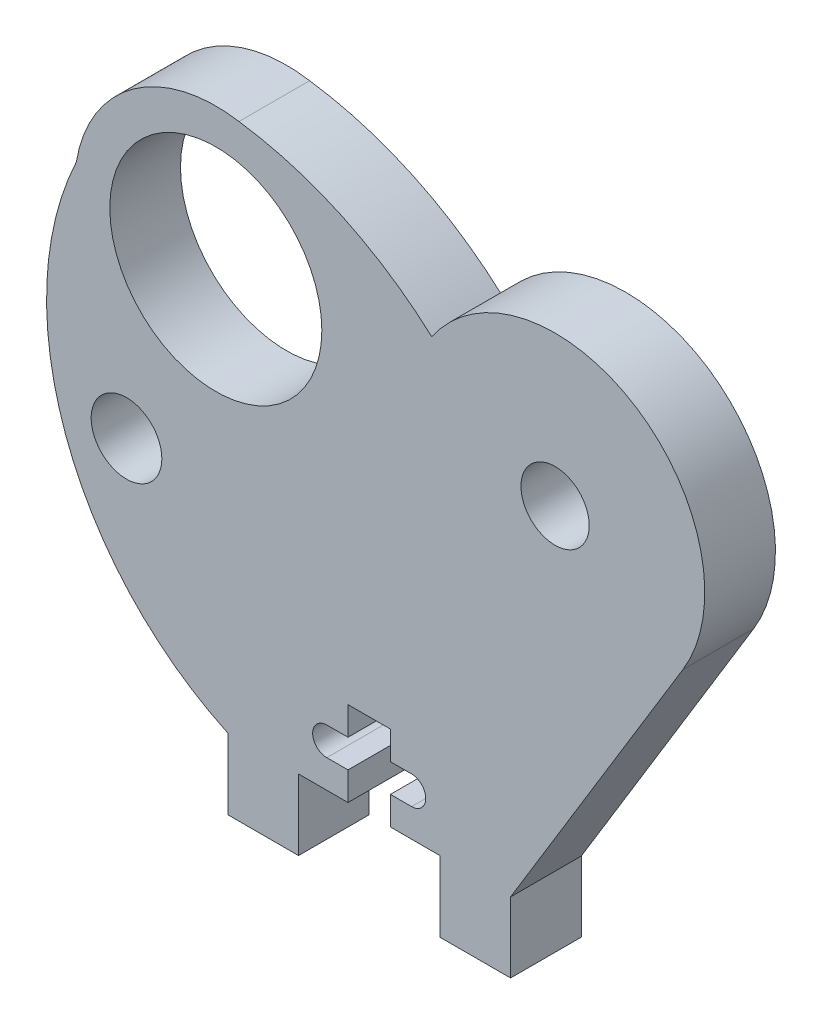
ISO-10303-21;
HEADER;
FILE_DESCRIPTION(('STEP AP214'),'2;1');
FILE_NAME('part.step','',(''),(''),'','','');
FILE_SCHEMA(('AUTOMOTIVE_DESIGN { 1 0 10303 214 1 1 1 1 }'));
ENDSEC;
DATA;
#1=APPLICATION_CONTEXT('core data for automotive mechanical design processes');
#2=APPLICATION_PROTOCOL_DEFINITION('international standard','automotive_design',2000,#1);
#3=PRODUCT_CONTEXT('',#1,'mechanical');
#4=PRODUCT('Part','Part','',(#3));
#5=PRODUCT_RELATED_PRODUCT_CATEGORY('part','',(#4));
#6=PRODUCT_DEFINITION_FORMATION('','',#4);
#7=PRODUCT_DEFINITION_CONTEXT('part definition',#1,'design');
#8=PRODUCT_DEFINITION('design','',#6,#7);
#9=PRODUCT_DEFINITION_SHAPE('','',#8);
#10=(LENGTH_UNIT() NAMED_UNIT(*) SI_UNIT(.MILLI.,.METRE.));
#11=(NAMED_UNIT(*) PLANE_ANGLE_UNIT() SI_UNIT($,.RADIAN.));
#12=(NAMED_UNIT(*) SI_UNIT($,.STERADIAN.) SOLID_ANGLE_UNIT());
#13=UNCERTAINTY_MEASURE_WITH_UNIT(LENGTH_MEASURE(1.E-05),#10,'distance_accuracy_value','');
#14=(GEOMETRIC_REPRESENTATION_CONTEXT(3) GLOBAL_UNCERTAINTY_ASSIGNED_CONTEXT((#13)) GLOBAL_UNIT_ASSIGNED_CONTEXT((#10,
#11,#12)) REPRESENTATION_CONTEXT('',''));
#15=CARTESIAN_POINT('',(0.,0.,0.));
#16=DIRECTION('',(0.,0.,1.));
#17=DIRECTION('',(1.,0.,0.));
#18=AXIS2_PLACEMENT_3D('',#15,#16,#17);
#19=CARTESIAN_POINT('',(-45.9705218873622,-22.4999732547637,5.));
#20=DIRECTION('',(0.,0.,1.));
#21=DIRECTION('',(1.,0.,0.));
#22=AXIS2_PLACEMENT_3D('',#19,#20,#21);
#23=PLANE('',#22);
#24=CARTESIAN_POINT('',(-45.9705218873622,-22.4999732547637,5.));
#25=DIRECTION('',(0.,0.,1.));
#26=DIRECTION('',(1.,0.,0.));
#27=AXIS2_PLACEMENT_3D('',#24,#25,#26);
#28=CIRCLE('',#27,2.41489173474901);
#29=CARTESIAN_POINT('',(-43.5556301526132,-22.4999732547637,5.));
#30=VERTEX_POINT('',#29);
#31=EDGE_CURVE('E443',#30,#30,#28,.T.);
#32=ORIENTED_EDGE('',*,*,#31,.F.);
#33=EDGE_LOOP('',(#32));
#34=FACE_BOUND('',#33,.T.);
#35=CARTESIAN_POINT('',(-45.9705218873622,-22.4999732547637,5.));
#36=DIRECTION('',(0.,0.,1.));
#37=DIRECTION('',(1.,0.,0.));
#38=AXIS2_PLACEMENT_3D('',#35,#36,#37);
#39=CIRCLE('',#38,10.5888484914704);
#40=CARTESIAN_POINT('',(-36.9263897715224,-28.0070039108024,5.));
#41=VERTEX_POINT('',#40);
#42=CARTESIAN_POINT('',(-54.6960432745177,-16.5008909168051,5.));
#43=VERTEX_POINT('',#42);
#44=EDGE_CURVE('E273',#41,#43,#39,.T.);
#45=ORIENTED_EDGE('',*,*,#44,.T.);
#46=CARTESIAN_POINT('',(-71.8378601354486,-35.4323222267459,5.));
#47=DIRECTION('',(0.,0.,1.));
#48=DIRECTION('',(1.,0.,0.));
#49=AXIS2_PLACEMENT_3D('',#46,#47,#48);
#50=CIRCLE('',#49,25.5390089223663);
#51=CARTESIAN_POINT('',(-68.334240227586,-10.1347803643844,5.));
#52=VERTEX_POINT('',#51);
#53=EDGE_CURVE('E141',#43,#52,#50,.T.);
#54=ORIENTED_EDGE('',*,*,#53,.T.);
#55=CARTESIAN_POINT('',(-69.9705218873622,-19.9999732547637,5.));
#56=DIRECTION('',(0.,0.,1.));
#57=DIRECTION('',(1.,0.,0.));
#58=AXIS2_PLACEMENT_3D('',#55,#56,#57);
#59=CIRCLE('',#58,9.99997242168743);
#60=CARTESIAN_POINT('',(-79.8357113359532,-18.3636708444745,5.));
#61=VERTEX_POINT('',#60);
#62=EDGE_CURVE('E336',#52,#61,#59,.T.);
#63=ORIENTED_EDGE('',*,*,#62,.T.);
#64=CARTESIAN_POINT('',(-59.6593073912363,-27.8235561993926,5.));
#65=DIRECTION('',(0.,0.,1.));
#66=DIRECTION('',(1.,0.,0.));
#67=AXIS2_PLACEMENT_3D('',#64,#65,#66);
#68=CIRCLE('',#67,22.2840011458576);
#69=CARTESIAN_POINT('',(-69.1191077395265,-48.,5.));
#70=VERTEX_POINT('',#69);
#71=EDGE_CURVE('E355',#61,#70,#68,.T.);
#72=ORIENTED_EDGE('',*,*,#71,.T.);
#73=DIRECTION('',(0.,-1.,0.));
#74=VECTOR('',#73,1.);
#75=CARTESIAN_POINT('',(-69.1191077395265,-48.,5.));
#76=LINE('',#75,#74);
#77=CARTESIAN_POINT('',(-69.1191077395265,-53.,5.));
#78=VERTEX_POINT('',#77);
#79=EDGE_CURVE('E352',#70,#78,#76,.T.);
#80=ORIENTED_EDGE('',*,*,#79,.T.);
#81=DIRECTION('',(1.,0.,0.));
#82=VECTOR('',#81,1.);
#83=CARTESIAN_POINT('',(-69.1191077395265,-53.,5.));
#84=LINE('',#83,#82);
#85=CARTESIAN_POINT('',(-64.1191077395265,-53.,5.));
#86=VERTEX_POINT('',#85);
#87=EDGE_CURVE('E354',#78,#86,#84,.T.);
#88=ORIENTED_EDGE('',*,*,#87,.T.);
#89=DIRECTION('',(0.,1.,0.));
#90=VECTOR('',#89,1.);
#91=CARTESIAN_POINT('',(-64.1191077395265,-48.,5.));
#92=LINE('',#91,#90);
#93=CARTESIAN_POINT('',(-64.1191077395265,-48.,5.));
#94=VERTEX_POINT('',#93);
#95=EDGE_CURVE('E357',#86,#94,#92,.T.);
#96=ORIENTED_EDGE('',*,*,#95,.T.);
#97=DIRECTION('',(1.,0.,0.));
#98=VECTOR('',#97,1.);
#99=CARTESIAN_POINT('',(-64.1191077395265,-48.,5.));
#100=LINE('',#99,#98);
#101=CARTESIAN_POINT('',(-60.6191197533204,-48.,5.));
#102=VERTEX_POINT('',#101);
#103=EDGE_CURVE('E363',#94,#102,#100,.T.);
#104=ORIENTED_EDGE('',*,*,#103,.T.);
#105=DIRECTION('',(0.,1.,0.));
#106=VECTOR('',#105,1.);
#107=CARTESIAN_POINT('',(-60.6191197533204,-46.,5.));
#108=LINE('',#107,#106);
#109=CARTESIAN_POINT('',(-60.6191197533204,-46.,5.));
#110=VERTEX_POINT('',#109);
#111=EDGE_CURVE('E365',#102,#110,#108,.T.);
#112=ORIENTED_EDGE('',*,*,#111,.T.);
#113=DIRECTION('',(-1.,0.,0.));
#114=VECTOR('',#113,1.);
#115=CARTESIAN_POINT('',(-62.1191197533204,-46.,5.));
#116=LINE('',#115,#114);
#117=CARTESIAN_POINT('',(-62.1191197533204,-46.,5.));
#118=VERTEX_POINT('',#117);
#119=EDGE_CURVE('E367',#110,#118,#116,.T.);
#120=ORIENTED_EDGE('',*,*,#119,.T.);
#121=CARTESIAN_POINT('',(-62.1191197533204,-45.,5.));
#122=DIRECTION('',(0.,0.,-1.));
#123=DIRECTION('',(1.,0.,0.));
#124=AXIS2_PLACEMENT_3D('',#121,#122,#123);
#125=CIRCLE('',#124,1.);
#126=CARTESIAN_POINT('',(-62.1191197533204,-44.,5.));
#127=VERTEX_POINT('',#126);
#128=EDGE_CURVE('E369',#118,#127,#125,.T.);
#129=ORIENTED_EDGE('',*,*,#128,.T.);
#130=DIRECTION('',(1.,0.,0.));
#131=VECTOR('',#130,1.);
#132=CARTESIAN_POINT('',(-62.1191197533204,-44.,5.));
#133=LINE('',#132,#131);
#134=CARTESIAN_POINT('',(-60.6191197533204,-44.,5.));
#135=VERTEX_POINT('',#134);
#136=EDGE_CURVE('E371',#127,#135,#133,.T.);
#137=ORIENTED_EDGE('',*,*,#136,.T.);
#138=DIRECTION('',(0.,1.,0.));
#139=VECTOR('',#138,1.);
#140=CARTESIAN_POINT('',(-60.6191197533204,-42.,5.));
#141=LINE('',#140,#139);
#142=CARTESIAN_POINT('',(-60.6191197533204,-42.,5.));
#143=VERTEX_POINT('',#142);
#144=EDGE_CURVE('E373',#135,#143,#141,.T.);
#145=ORIENTED_EDGE('',*,*,#144,.T.);
#146=DIRECTION('',(1.,0.,0.));
#147=VECTOR('',#146,1.);
#148=CARTESIAN_POINT('',(-60.6191197533204,-42.,5.));
#149=LINE('',#148,#147);
#150=CARTESIAN_POINT('',(-57.6191197533204,-42.,5.));
#151=VERTEX_POINT('',#150);
#152=EDGE_CURVE('E375',#143,#151,#149,.T.);
#153=ORIENTED_EDGE('',*,*,#152,.T.);
#154=DIRECTION('',(0.,-1.,0.));
#155=VECTOR('',#154,1.);
#156=CARTESIAN_POINT('',(-57.6191197533204,-42.,5.));
#157=LINE('',#156,#155);
#158=CARTESIAN_POINT('',(-57.6191197533204,-44.,5.));
#159=VERTEX_POINT('',#158);
#160=EDGE_CURVE('E377',#151,#159,#157,.T.);
#161=ORIENTED_EDGE('',*,*,#160,.T.);
#162=DIRECTION('',(1.,0.,0.));
#163=VECTOR('',#162,1.);
#164=CARTESIAN_POINT('',(-57.6191197533204,-44.,5.));
#165=LINE('',#164,#163);
#166=CARTESIAN_POINT('',(-56.1191197533204,-44.,5.));
#167=VERTEX_POINT('',#166);
#168=EDGE_CURVE('E379',#159,#167,#165,.T.);
#169=ORIENTED_EDGE('',*,*,#168,.T.);
#170=CARTESIAN_POINT('',(-56.1191197533204,-45.,5.));
#171=DIRECTION('',(0.,0.,-1.));
#172=DIRECTION('',(1.,0.,0.));
#173=AXIS2_PLACEMENT_3D('',#170,#171,#172);
#174=CIRCLE('',#173,1.);
#175=CARTESIAN_POINT('',(-56.1191197533204,-46.,5.));
#176=VERTEX_POINT('',#175);
#177=EDGE_CURVE('E381',#167,#176,#174,.T.);
#178=ORIENTED_EDGE('',*,*,#177,.T.);
#179=DIRECTION('',(-1.,0.,0.));
#180=VECTOR('',#179,1.);
#181=CARTESIAN_POINT('',(-57.6191197533204,-46.,5.));
#182=LINE('',#181,#180);
#183=CARTESIAN_POINT('',(-57.6191197533204,-46.,5.));
#184=VERTEX_POINT('',#183);
#185=EDGE_CURVE('E383',#176,#184,#182,.T.);
#186=ORIENTED_EDGE('',*,*,#185,.T.);
#187=DIRECTION('',(0.,-1.,0.));
#188=VECTOR('',#187,1.);
#189=CARTESIAN_POINT('',(-57.6191197533204,-46.,5.));
#190=LINE('',#189,#188);
#191=CARTESIAN_POINT('',(-57.6191197533204,-48.,5.));
#192=VERTEX_POINT('',#191);
#193=EDGE_CURVE('E385',#184,#192,#190,.T.);
#194=ORIENTED_EDGE('',*,*,#193,.T.);
#195=DIRECTION('',(1.,0.,0.));
#196=VECTOR('',#195,1.);
#197=CARTESIAN_POINT('',(-57.6191197533204,-48.,5.));
#198=LINE('',#197,#196);
#199=CARTESIAN_POINT('',(-54.1191317671144,-48.,5.));
#200=VERTEX_POINT('',#199);
#201=EDGE_CURVE('E387',#192,#200,#198,.T.);
#202=ORIENTED_EDGE('',*,*,#201,.T.);
#203=DIRECTION('',(0.,-1.,0.));
#204=VECTOR('',#203,1.);
#205=CARTESIAN_POINT('',(-54.1191317671144,-48.,5.));
#206=LINE('',#205,#204);
#207=CARTESIAN_POINT('',(-54.1191317671144,-53.,5.));
#208=VERTEX_POINT('',#207);
#209=EDGE_CURVE('E208',#200,#208,#206,.T.);
#210=ORIENTED_EDGE('',*,*,#209,.T.);
#211=DIRECTION('',(1.,0.,0.));
#212=VECTOR('',#211,1.);
#213=CARTESIAN_POINT('',(-49.1191317671144,-53.,5.));
#214=LINE('',#213,#212);
#215=CARTESIAN_POINT('',(-49.1191317671144,-53.,5.));
#216=VERTEX_POINT('',#215);
#217=EDGE_CURVE('E202',#208,#216,#214,.T.);
#218=ORIENTED_EDGE('',*,*,#217,.T.);
#219=DIRECTION('',(0.,1.,0.));
#220=VECTOR('',#219,1.);
#221=CARTESIAN_POINT('',(-49.1191317671144,-48.0310016602178,5.));
#222=LINE('',#221,#220);
#223=CARTESIAN_POINT('',(-49.1191317671144,-48.0310016602178,5.));
#224=VERTEX_POINT('',#223);
#225=EDGE_CURVE('E206',#216,#224,#222,.T.);
#226=ORIENTED_EDGE('',*,*,#225,.T.);
#227=DIRECTION('',(0.520078331508363,0.854118568522824,0.));
#228=VECTOR('',#227,1.);
#229=CARTESIAN_POINT('',(-49.1191317671144,-48.0310016602178,5.));
#230=LINE('',#229,#228);
#231=EDGE_CURVE('E50',#224,#41,#230,.T.);
#232=ORIENTED_EDGE('',*,*,#231,.T.);
#233=EDGE_LOOP('',(#45,#54,#63,#72,#80,#88,#96,#104,#112,#120,#129,#137,#145,#153,#161,#169,
#178,#186,#194,#202,#210,#218,#226,#232));
#234=FACE_BOUND('',#233,.T.);
#235=CARTESIAN_POINT('',(-69.9705218873622,-19.9999732547637,5.));
#236=DIRECTION('',(0.,0.,1.));
#237=DIRECTION('',(1.,0.,0.));
#238=AXIS2_PLACEMENT_3D('',#235,#236,#237);
#239=CIRCLE('',#238,7.50000000000001);
#240=CARTESIAN_POINT('',(-62.4705218873622,-19.9999732547637,5.));
#241=VERTEX_POINT('',#240);
#242=EDGE_CURVE('E230',#241,#241,#239,.T.);
#243=ORIENTED_EDGE('',*,*,#242,.F.);
#244=EDGE_LOOP('',(#243));
#245=FACE_BOUND('',#244,.T.);
#246=CARTESIAN_POINT('',(-76.2888296555649,-33.5236434730844,5.));
#247=DIRECTION('',(0.,0.,1.));
#248=DIRECTION('',(1.,0.,0.));
#249=AXIS2_PLACEMENT_3D('',#246,#247,#248);
#250=CIRCLE('',#249,2.5);
#251=CARTESIAN_POINT('',(-73.7888296555649,-33.5236434730844,5.));
#252=VERTEX_POINT('',#251);
#253=EDGE_CURVE('E434',#252,#252,#250,.T.);
#254=ORIENTED_EDGE('',*,*,#253,.F.);
#255=EDGE_LOOP('',(#254));
#256=FACE_BOUND('',#255,.T.);
#257=ADVANCED_FACE('F33',(#34,#234,#245,#256),#23,.T.);
#258=CARTESIAN_POINT('',(-45.9705218873622,-22.4999732547637,0.));
#259=DIRECTION('',(0.,0.,1.));
#260=DIRECTION('',(1.,0.,0.));
#261=AXIS2_PLACEMENT_3D('',#258,#259,#260);
#262=PLANE('',#261);
#263=CARTESIAN_POINT('',(-45.9705218873622,-22.4999732547637,0.));
#264=DIRECTION('',(0.,0.,1.));
#265=DIRECTION('',(1.,0.,0.));
#266=AXIS2_PLACEMENT_3D('',#263,#264,#265);
#267=CIRCLE('',#266,2.41489173474901);
#268=CARTESIAN_POINT('',(-43.5556301526132,-22.4999732547637,0.));
#269=VERTEX_POINT('',#268);
#270=EDGE_CURVE('E440',#269,#269,#267,.T.);
#271=ORIENTED_EDGE('',*,*,#270,.T.);
#272=EDGE_LOOP('',(#271));
#273=FACE_BOUND('',#272,.T.);
#274=CARTESIAN_POINT('',(-45.9705218873622,-22.4999732547637,0.));
#275=DIRECTION('',(0.,0.,1.));
#276=DIRECTION('',(1.,0.,0.));
#277=AXIS2_PLACEMENT_3D('',#274,#275,#276);
#278=CIRCLE('',#277,10.5888484914704);
#279=CARTESIAN_POINT('',(-36.9263897715224,-28.0070039108024,0.));
#280=VERTEX_POINT('',#279);
#281=CARTESIAN_POINT('',(-54.6960432745177,-16.5008909168051,0.));
#282=VERTEX_POINT('',#281);
#283=EDGE_CURVE('E226',#280,#282,#278,.T.);
#284=ORIENTED_EDGE('',*,*,#283,.F.);
#285=DIRECTION('',(0.520078331508363,0.854118568522824,0.));
#286=VECTOR('',#285,1.);
#287=CARTESIAN_POINT('',(-49.1191317671144,-48.0310016602178,0.));
#288=LINE('',#287,#286);
#289=CARTESIAN_POINT('',(-49.1191317671144,-48.0310016602178,0.));
#290=VERTEX_POINT('',#289);
#291=EDGE_CURVE('E133',#290,#280,#288,.T.);
#292=ORIENTED_EDGE('',*,*,#291,.F.);
#293=DIRECTION('',(0.,1.,0.));
#294=VECTOR('',#293,1.);
#295=CARTESIAN_POINT('',(-49.1191317671144,-48.0310016602178,0.));
#296=LINE('',#295,#294);
#297=CARTESIAN_POINT('',(-49.1191317671144,-53.,0.));
#298=VERTEX_POINT('',#297);
#299=EDGE_CURVE('E127',#298,#290,#296,.T.);
#300=ORIENTED_EDGE('',*,*,#299,.F.);
#301=DIRECTION('',(1.,0.,0.));
#302=VECTOR('',#301,1.);
#303=CARTESIAN_POINT('',(-49.1191317671144,-53.,0.));
#304=LINE('',#303,#302);
#305=CARTESIAN_POINT('',(-54.1191317671144,-53.,0.));
#306=VERTEX_POINT('',#305);
#307=EDGE_CURVE('E216',#306,#298,#304,.T.);
#308=ORIENTED_EDGE('',*,*,#307,.F.);
#309=DIRECTION('',(0.,-1.,0.));
#310=VECTOR('',#309,1.);
#311=CARTESIAN_POINT('',(-54.1191317671144,-48.,0.));
#312=LINE('',#311,#310);
#313=CARTESIAN_POINT('',(-54.1191317671144,-48.,0.));
#314=VERTEX_POINT('',#313);
#315=EDGE_CURVE('E268',#314,#306,#312,.T.);
#316=ORIENTED_EDGE('',*,*,#315,.F.);
#317=DIRECTION('',(1.,0.,0.));
#318=VECTOR('',#317,1.);
#319=CARTESIAN_POINT('',(-57.6191197533204,-48.,0.));
#320=LINE('',#319,#318);
#321=CARTESIAN_POINT('',(-57.6191197533204,-48.,0.));
#322=VERTEX_POINT('',#321);
#323=EDGE_CURVE('E266',#322,#314,#320,.T.);
#324=ORIENTED_EDGE('',*,*,#323,.F.);
#325=DIRECTION('',(0.,-1.,0.));
#326=VECTOR('',#325,1.);
#327=CARTESIAN_POINT('',(-57.6191197533204,-46.,0.));
#328=LINE('',#327,#326);
#329=CARTESIAN_POINT('',(-57.6191197533204,-46.,0.));
#330=VERTEX_POINT('',#329);
#331=EDGE_CURVE('E264',#330,#322,#328,.T.);
#332=ORIENTED_EDGE('',*,*,#331,.F.);
#333=DIRECTION('',(-1.,0.,0.));
#334=VECTOR('',#333,1.);
#335=CARTESIAN_POINT('',(-57.6191197533204,-46.,0.));
#336=LINE('',#335,#334);
#337=CARTESIAN_POINT('',(-56.1191197533204,-46.,0.));
#338=VERTEX_POINT('',#337);
#339=EDGE_CURVE('E262',#338,#330,#336,.T.);
#340=ORIENTED_EDGE('',*,*,#339,.F.);
#341=CARTESIAN_POINT('',(-56.1191197533204,-45.,0.));
#342=DIRECTION('',(0.,0.,-1.));
#343=DIRECTION('',(1.,0.,0.));
#344=AXIS2_PLACEMENT_3D('',#341,#342,#343);
#345=CIRCLE('',#344,1.);
#346=CARTESIAN_POINT('',(-56.1191197533204,-44.,0.));
#347=VERTEX_POINT('',#346);
#348=EDGE_CURVE('E260',#347,#338,#345,.T.);
#349=ORIENTED_EDGE('',*,*,#348,.F.);
#350=DIRECTION('',(1.,0.,0.));
#351=VECTOR('',#350,1.);
#352=CARTESIAN_POINT('',(-57.6191197533204,-44.,0.));
#353=LINE('',#352,#351);
#354=CARTESIAN_POINT('',(-57.6191197533204,-44.,0.));
#355=VERTEX_POINT('',#354);
#356=EDGE_CURVE('E258',#355,#347,#353,.T.);
#357=ORIENTED_EDGE('',*,*,#356,.F.);
#358=DIRECTION('',(0.,-1.,0.));
#359=VECTOR('',#358,1.);
#360=CARTESIAN_POINT('',(-57.6191197533204,-42.,0.));
#361=LINE('',#360,#359);
#362=CARTESIAN_POINT('',(-57.6191197533204,-42.,0.));
#363=VERTEX_POINT('',#362);
#364=EDGE_CURVE('E256',#363,#355,#361,.T.);
#365=ORIENTED_EDGE('',*,*,#364,.F.);
#366=DIRECTION('',(1.,0.,0.));
#367=VECTOR('',#366,1.);
#368=CARTESIAN_POINT('',(-60.6191197533204,-42.,0.));
#369=LINE('',#368,#367);
#370=CARTESIAN_POINT('',(-60.6191197533204,-42.,0.));
#371=VERTEX_POINT('',#370);
#372=EDGE_CURVE('E254',#371,#363,#369,.T.);
#373=ORIENTED_EDGE('',*,*,#372,.F.);
#374=DIRECTION('',(0.,1.,0.));
#375=VECTOR('',#374,1.);
#376=CARTESIAN_POINT('',(-60.6191197533204,-42.,0.));
#377=LINE('',#376,#375);
#378=CARTESIAN_POINT('',(-60.6191197533204,-44.,0.));
#379=VERTEX_POINT('',#378);
#380=EDGE_CURVE('E252',#379,#371,#377,.T.);
#381=ORIENTED_EDGE('',*,*,#380,.F.);
#382=DIRECTION('',(1.,0.,0.));
#383=VECTOR('',#382,1.);
#384=CARTESIAN_POINT('',(-62.1191197533204,-44.,0.));
#385=LINE('',#384,#383);
#386=CARTESIAN_POINT('',(-62.1191197533204,-44.,0.));
#387=VERTEX_POINT('',#386);
#388=EDGE_CURVE('E250',#387,#379,#385,.T.);
#389=ORIENTED_EDGE('',*,*,#388,.F.);
#390=CARTESIAN_POINT('',(-62.1191197533204,-45.,0.));
#391=DIRECTION('',(0.,0.,-1.));
#392=DIRECTION('',(1.,0.,0.));
#393=AXIS2_PLACEMENT_3D('',#390,#391,#392);
#394=CIRCLE('',#393,1.);
#395=CARTESIAN_POINT('',(-62.1191197533204,-46.,0.));
#396=VERTEX_POINT('',#395);
#397=EDGE_CURVE('E248',#396,#387,#394,.T.);
#398=ORIENTED_EDGE('',*,*,#397,.F.);
#399=DIRECTION('',(-1.,0.,0.));
#400=VECTOR('',#399,1.);
#401=CARTESIAN_POINT('',(-62.1191197533204,-46.,0.));
#402=LINE('',#401,#400);
#403=CARTESIAN_POINT('',(-60.6191197533204,-46.,0.));
#404=VERTEX_POINT('',#403);
#405=EDGE_CURVE('E246',#404,#396,#402,.T.);
#406=ORIENTED_EDGE('',*,*,#405,.F.);
#407=DIRECTION('',(0.,1.,0.));
#408=VECTOR('',#407,1.);
#409=CARTESIAN_POINT('',(-60.6191197533204,-46.,0.));
#410=LINE('',#409,#408);
#411=CARTESIAN_POINT('',(-60.6191197533204,-48.,0.));
#412=VERTEX_POINT('',#411);
#413=EDGE_CURVE('E244',#412,#404,#410,.T.);
#414=ORIENTED_EDGE('',*,*,#413,.F.);
#415=DIRECTION('',(1.,0.,0.));
#416=VECTOR('',#415,1.);
#417=CARTESIAN_POINT('',(-64.1191077395265,-48.,0.));
#418=LINE('',#417,#416);
#419=CARTESIAN_POINT('',(-64.1191077395265,-48.,0.));
#420=VERTEX_POINT('',#419);
#421=EDGE_CURVE('E242',#420,#412,#418,.T.);
#422=ORIENTED_EDGE('',*,*,#421,.F.);
#423=DIRECTION('',(0.,1.,0.));
#424=VECTOR('',#423,1.);
#425=CARTESIAN_POINT('',(-64.1191077395265,-48.,0.));
#426=LINE('',#425,#424);
#427=CARTESIAN_POINT('',(-64.1191077395265,-53.,0.));
#428=VERTEX_POINT('',#427);
#429=EDGE_CURVE('E240',#428,#420,#426,.T.);
#430=ORIENTED_EDGE('',*,*,#429,.F.);
#431=DIRECTION('',(1.,0.,0.));
#432=VECTOR('',#431,1.);
#433=CARTESIAN_POINT('',(-69.1191077395265,-53.,0.));
#434=LINE('',#433,#432);
#435=CARTESIAN_POINT('',(-69.1191077395265,-53.,0.));
#436=VERTEX_POINT('',#435);
#437=EDGE_CURVE('E238',#436,#428,#434,.T.);
#438=ORIENTED_EDGE('',*,*,#437,.F.);
#439=DIRECTION('',(0.,-1.,0.));
#440=VECTOR('',#439,1.);
#441=CARTESIAN_POINT('',(-69.1191077395265,-48.,0.));
#442=LINE('',#441,#440);
#443=CARTESIAN_POINT('',(-69.1191077395265,-48.,0.));
#444=VERTEX_POINT('',#443);
#445=EDGE_CURVE('E236',#444,#436,#442,.T.);
#446=ORIENTED_EDGE('',*,*,#445,.F.);
#447=CARTESIAN_POINT('',(-59.6593073912363,-27.8235561993926,0.));
#448=DIRECTION('',(0.,0.,1.));
#449=DIRECTION('',(1.,0.,0.));
#450=AXIS2_PLACEMENT_3D('',#447,#448,#449);
#451=CIRCLE('',#450,22.2840011458576);
#452=CARTESIAN_POINT('',(-79.8357113359532,-18.3636708444745,0.));
#453=VERTEX_POINT('',#452);
#454=EDGE_CURVE('E234',#453,#444,#451,.T.);
#455=ORIENTED_EDGE('',*,*,#454,.F.);
#456=CARTESIAN_POINT('',(-69.9705218873622,-19.9999732547637,0.));
#457=DIRECTION('',(0.,0.,1.));
#458=DIRECTION('',(1.,0.,0.));
#459=AXIS2_PLACEMENT_3D('',#456,#457,#458);
#460=CIRCLE('',#459,9.99997242168743);
#461=CARTESIAN_POINT('',(-68.334240227586,-10.1347803643844,0.));
#462=VERTEX_POINT('',#461);
#463=EDGE_CURVE('E232',#462,#453,#460,.T.);
#464=ORIENTED_EDGE('',*,*,#463,.F.);
#465=CARTESIAN_POINT('',(-71.8378601354486,-35.4323222267459,0.));
#466=DIRECTION('',(0.,0.,1.));
#467=DIRECTION('',(1.,0.,0.));
#468=AXIS2_PLACEMENT_3D('',#465,#466,#467);
#469=CIRCLE('',#468,25.5390089223663);
#470=EDGE_CURVE('E229',#282,#462,#469,.T.);
#471=ORIENTED_EDGE('',*,*,#470,.F.);
#472=EDGE_LOOP('',(#284,#292,#300,#308,#316,#324,#332,#340,#349,#357,#365,#373,#381,#389,#398,
#406,#414,#422,#430,#438,#446,#455,#464,#471));
#473=FACE_BOUND('',#472,.T.);
#474=CARTESIAN_POINT('',(-69.9705218873622,-19.9999732547637,0.));
#475=DIRECTION('',(0.,0.,1.));
#476=DIRECTION('',(1.,0.,0.));
#477=AXIS2_PLACEMENT_3D('',#474,#475,#476);
#478=CIRCLE('',#477,7.50000000000001);
#479=CARTESIAN_POINT('',(-62.4705218873622,-19.9999732547637,0.));
#480=VERTEX_POINT('',#479);
#481=EDGE_CURVE('E446',#480,#480,#478,.T.);
#482=ORIENTED_EDGE('',*,*,#481,.T.);
#483=EDGE_LOOP('',(#482));
#484=FACE_BOUND('',#483,.T.);
#485=CARTESIAN_POINT('',(-76.2888296555649,-33.5236434730844,0.));
#486=DIRECTION('',(0.,0.,1.));
#487=DIRECTION('',(1.,0.,0.));
#488=AXIS2_PLACEMENT_3D('',#485,#486,#487);
#489=CIRCLE('',#488,2.5);
#490=CARTESIAN_POINT('',(-73.7888296555649,-33.5236434730844,0.));
#491=VERTEX_POINT('',#490);
#492=EDGE_CURVE('E437',#491,#491,#489,.T.);
#493=ORIENTED_EDGE('',*,*,#492,.T.);
#494=EDGE_LOOP('',(#493));
#495=FACE_BOUND('',#494,.T.);
#496=ADVANCED_FACE('F340',(#273,#473,#484,#495),#262,.F.);
#497=CARTESIAN_POINT('',(-45.9705218873622,-22.4999732547637,5.));
#498=DIRECTION('',(0.,0.,-1.));
#499=DIRECTION('',(-1.,0.,0.));
#500=AXIS2_PLACEMENT_3D('',#497,#498,#499);
#501=CYLINDRICAL_SURFACE('',#500,10.5888484914704);
#502=ORIENTED_EDGE('',*,*,#283,.T.);
#503=DIRECTION('',(0.,0.,-1.));
#504=VECTOR('',#503,1.);
#505=CARTESIAN_POINT('',(-54.6960432745177,-16.5008909168051,5.));
#506=LINE('',#505,#504);
#507=EDGE_CURVE('E11',#43,#282,#506,.T.);
#508=ORIENTED_EDGE('',*,*,#507,.F.);
#509=ORIENTED_EDGE('',*,*,#44,.F.);
#510=DIRECTION('',(0.,0.,-1.));
#511=VECTOR('',#510,1.);
#512=CARTESIAN_POINT('',(-36.9263897715224,-28.0070039108024,5.));
#513=LINE('',#512,#511);
#514=EDGE_CURVE('E222',#41,#280,#513,.T.);
#515=ORIENTED_EDGE('',*,*,#514,.T.);
#516=EDGE_LOOP('',(#502,#508,#509,#515));
#517=FACE_BOUND('',#516,.T.);
#518=ADVANCED_FACE('F35',(#517),#501,.T.);
#519=CARTESIAN_POINT('',(-71.8378601354486,-35.4323222267459,5.));
#520=DIRECTION('',(0.,0.,-1.));
#521=DIRECTION('',(-1.,0.,0.));
#522=AXIS2_PLACEMENT_3D('',#519,#520,#521);
#523=CYLINDRICAL_SURFACE('',#522,25.5390089223663);
#524=ORIENTED_EDGE('',*,*,#470,.T.);
#525=DIRECTION('',(0.,0.,-1.));
#526=VECTOR('',#525,1.);
#527=CARTESIAN_POINT('',(-68.334240227586,-10.1347803643844,5.));
#528=LINE('',#527,#526);
#529=EDGE_CURVE('E42',#52,#462,#528,.T.);
#530=ORIENTED_EDGE('',*,*,#529,.F.);
#531=ORIENTED_EDGE('',*,*,#53,.F.);
#532=ORIENTED_EDGE('',*,*,#507,.T.);
#533=EDGE_LOOP('',(#524,#530,#531,#532));
#534=FACE_BOUND('',#533,.T.);
#535=ADVANCED_FACE('F667',(#534),#523,.T.);
#536=CARTESIAN_POINT('',(-69.9705218873622,-19.9999732547637,5.));
#537=DIRECTION('',(0.,0.,-1.));
#538=DIRECTION('',(-1.,0.,0.));
#539=AXIS2_PLACEMENT_3D('',#536,#537,#538);
#540=CYLINDRICAL_SURFACE('',#539,9.99997242168743);
#541=ORIENTED_EDGE('',*,*,#463,.T.);
#542=DIRECTION('',(0.,0.,-1.));
#543=VECTOR('',#542,1.);
#544=CARTESIAN_POINT('',(-79.8357113359532,-18.3636708444745,5.));
#545=LINE('',#544,#543);
#546=EDGE_CURVE('E328',#61,#453,#545,.T.);
#547=ORIENTED_EDGE('',*,*,#546,.F.);
#548=ORIENTED_EDGE('',*,*,#62,.F.);
#549=ORIENTED_EDGE('',*,*,#529,.T.);
#550=EDGE_LOOP('',(#541,#547,#548,#549));
#551=FACE_BOUND('',#550,.T.);
#552=ADVANCED_FACE('F334',(#551),#540,.T.);
#553=CARTESIAN_POINT('',(-59.6593073912363,-27.8235561993926,5.));
#554=DIRECTION('',(0.,0.,-1.));
#555=DIRECTION('',(-1.,0.,0.));
#556=AXIS2_PLACEMENT_3D('',#553,#554,#555);
#557=CYLINDRICAL_SURFACE('',#556,22.2840011458576);
#558=ORIENTED_EDGE('',*,*,#454,.T.);
#559=DIRECTION('',(0.,0.,-1.));
#560=VECTOR('',#559,1.);
#561=CARTESIAN_POINT('',(-69.1191077395265,-48.,5.));
#562=LINE('',#561,#560);
#563=EDGE_CURVE('E325',#70,#444,#562,.T.);
#564=ORIENTED_EDGE('',*,*,#563,.F.);
#565=ORIENTED_EDGE('',*,*,#71,.F.);
#566=ORIENTED_EDGE('',*,*,#546,.T.);
#567=EDGE_LOOP('',(#558,#564,#565,#566));
#568=FACE_BOUND('',#567,.T.);
#569=ADVANCED_FACE('F346',(#568),#557,.T.);
#570=CARTESIAN_POINT('',(-69.1191077395265,-48.,5.));
#571=DIRECTION('',(1.,0.,0.));
#572=DIRECTION('',(0.,0.,-1.));
#573=AXIS2_PLACEMENT_3D('',#570,#571,#572);
#574=PLANE('',#573);
#575=ORIENTED_EDGE('',*,*,#445,.T.);
#576=DIRECTION('',(0.,0.,-1.));
#577=VECTOR('',#576,1.);
#578=CARTESIAN_POINT('',(-69.1191077395265,-53.,5.));
#579=LINE('',#578,#577);
#580=EDGE_CURVE('E322',#78,#436,#579,.T.);
#581=ORIENTED_EDGE('',*,*,#580,.F.);
#582=ORIENTED_EDGE('',*,*,#79,.F.);
#583=ORIENTED_EDGE('',*,*,#563,.T.);
#584=EDGE_LOOP('',(#575,#581,#582,#583));
#585=FACE_BOUND('',#584,.T.);
#586=ADVANCED_FACE('F350',(#585),#574,.F.);
#587=CARTESIAN_POINT('',(-69.1191077395265,-53.,5.));
#588=DIRECTION('',(0.,1.,0.));
#589=DIRECTION('',(0.,0.,1.));
#590=AXIS2_PLACEMENT_3D('',#587,#588,#589);
#591=PLANE('',#590);
#592=ORIENTED_EDGE('',*,*,#437,.T.);
#593=DIRECTION('',(0.,0.,-1.));
#594=VECTOR('',#593,1.);
#595=CARTESIAN_POINT('',(-64.1191077395265,-53.,5.));
#596=LINE('',#595,#594);
#597=EDGE_CURVE('E319',#86,#428,#596,.T.);
#598=ORIENTED_EDGE('',*,*,#597,.F.);
#599=ORIENTED_EDGE('',*,*,#87,.F.);
#600=ORIENTED_EDGE('',*,*,#580,.T.);
#601=EDGE_LOOP('',(#592,#598,#599,#600));
#602=FACE_BOUND('',#601,.T.);
#603=ADVANCED_FACE('F632',(#602),#591,.F.);
#604=CARTESIAN_POINT('',(-64.1191077395265,-48.,5.));
#605=DIRECTION('',(-1.,0.,0.));
#606=DIRECTION('',(0.,0.,1.));
#607=AXIS2_PLACEMENT_3D('',#604,#605,#606);
#608=PLANE('',#607);
#609=ORIENTED_EDGE('',*,*,#429,.T.);
#610=DIRECTION('',(0.,0.,-1.));
#611=VECTOR('',#610,1.);
#612=CARTESIAN_POINT('',(-64.1191077395265,-48.,5.));
#613=LINE('',#612,#611);
#614=EDGE_CURVE('E316',#94,#420,#613,.T.);
#615=ORIENTED_EDGE('',*,*,#614,.F.);
#616=ORIENTED_EDGE('',*,*,#95,.F.);
#617=ORIENTED_EDGE('',*,*,#597,.T.);
#618=EDGE_LOOP('',(#609,#615,#616,#617));
#619=FACE_BOUND('',#618,.T.);
#620=ADVANCED_FACE('F622',(#619),#608,.F.);
#621=CARTESIAN_POINT('',(-64.1191077395265,-48.,5.));
#622=DIRECTION('',(0.,1.,0.));
#623=DIRECTION('',(0.,0.,1.));
#624=AXIS2_PLACEMENT_3D('',#621,#622,#623);
#625=PLANE('',#624);
#626=ORIENTED_EDGE('',*,*,#421,.T.);
#627=DIRECTION('',(0.,0.,-1.));
#628=VECTOR('',#627,1.);
#629=CARTESIAN_POINT('',(-60.6191197533204,-48.,5.));
#630=LINE('',#629,#628);
#631=EDGE_CURVE('E313',#102,#412,#630,.T.);
#632=ORIENTED_EDGE('',*,*,#631,.F.);
#633=ORIENTED_EDGE('',*,*,#103,.F.);
#634=ORIENTED_EDGE('',*,*,#614,.T.);
#635=EDGE_LOOP('',(#626,#632,#633,#634));
#636=FACE_BOUND('',#635,.T.);
#637=ADVANCED_FACE('F612',(#636),#625,.F.);
#638=CARTESIAN_POINT('',(-60.6191197533204,-46.,5.));
#639=DIRECTION('',(-1.,0.,0.));
#640=DIRECTION('',(0.,0.,1.));
#641=AXIS2_PLACEMENT_3D('',#638,#639,#640);
#642=PLANE('',#641);
#643=ORIENTED_EDGE('',*,*,#413,.T.);
#644=DIRECTION('',(0.,0.,-1.));
#645=VECTOR('',#644,1.);
#646=CARTESIAN_POINT('',(-60.6191197533204,-46.,5.));
#647=LINE('',#646,#645);
#648=EDGE_CURVE('E310',#110,#404,#647,.T.);
#649=ORIENTED_EDGE('',*,*,#648,.F.);
#650=ORIENTED_EDGE('',*,*,#111,.F.);
#651=ORIENTED_EDGE('',*,*,#631,.T.);
#652=EDGE_LOOP('',(#643,#649,#650,#651));
#653=FACE_BOUND('',#652,.T.);
#654=ADVANCED_FACE('F602',(#653),#642,.F.);
#655=CARTESIAN_POINT('',(-62.1191197533204,-46.,5.));
#656=DIRECTION('',(0.,-1.,0.));
#657=DIRECTION('',(0.,0.,-1.));
#658=AXIS2_PLACEMENT_3D('',#655,#656,#657);
#659=PLANE('',#658);
#660=ORIENTED_EDGE('',*,*,#405,.T.);
#661=DIRECTION('',(0.,0.,-1.));
#662=VECTOR('',#661,1.);
#663=CARTESIAN_POINT('',(-62.1191197533204,-46.,5.));
#664=LINE('',#663,#662);
#665=EDGE_CURVE('E307',#118,#396,#664,.T.);
#666=ORIENTED_EDGE('',*,*,#665,.F.);
#667=ORIENTED_EDGE('',*,*,#119,.F.);
#668=ORIENTED_EDGE('',*,*,#648,.T.);
#669=EDGE_LOOP('',(#660,#666,#667,#668));
#670=FACE_BOUND('',#669,.T.);
#671=ADVANCED_FACE('F592',(#670),#659,.F.);
#672=CARTESIAN_POINT('',(-62.1191197533204,-45.,5.));
#673=DIRECTION('',(0.,0.,-1.));
#674=DIRECTION('',(-1.,0.,0.));
#675=AXIS2_PLACEMENT_3D('',#672,#673,#674);
#676=CYLINDRICAL_SURFACE('',#675,1.);
#677=ORIENTED_EDGE('',*,*,#397,.T.);
#678=DIRECTION('',(0.,0.,-1.));
#679=VECTOR('',#678,1.);
#680=CARTESIAN_POINT('',(-62.1191197533204,-44.,5.));
#681=LINE('',#680,#679);
#682=EDGE_CURVE('E304',#127,#387,#681,.T.);
#683=ORIENTED_EDGE('',*,*,#682,.F.);
#684=ORIENTED_EDGE('',*,*,#128,.F.);
#685=ORIENTED_EDGE('',*,*,#665,.T.);
#686=EDGE_LOOP('',(#677,#683,#684,#685));
#687=FACE_BOUND('',#686,.T.);
#688=ADVANCED_FACE('F582',(#687),#676,.F.);
#689=CARTESIAN_POINT('',(-62.1191197533204,-44.,5.));
#690=DIRECTION('',(0.,1.,0.));
#691=DIRECTION('',(0.,0.,1.));
#692=AXIS2_PLACEMENT_3D('',#689,#690,#691);
#693=PLANE('',#692);
#694=ORIENTED_EDGE('',*,*,#388,.T.);
#695=DIRECTION('',(0.,0.,-1.));
#696=VECTOR('',#695,1.);
#697=CARTESIAN_POINT('',(-60.6191197533204,-44.,5.));
#698=LINE('',#697,#696);
#699=EDGE_CURVE('E301',#135,#379,#698,.T.);
#700=ORIENTED_EDGE('',*,*,#699,.F.);
#701=ORIENTED_EDGE('',*,*,#136,.F.);
#702=ORIENTED_EDGE('',*,*,#682,.T.);
#703=EDGE_LOOP('',(#694,#700,#701,#702));
#704=FACE_BOUND('',#703,.T.);
#705=ADVANCED_FACE('F572',(#704),#693,.F.);
#706=CARTESIAN_POINT('',(-60.6191197533204,-42.,5.));
#707=DIRECTION('',(-1.,0.,0.));
#708=DIRECTION('',(0.,0.,1.));
#709=AXIS2_PLACEMENT_3D('',#706,#707,#708);
#710=PLANE('',#709);
#711=ORIENTED_EDGE('',*,*,#380,.T.);
#712=DIRECTION('',(0.,0.,-1.));
#713=VECTOR('',#712,1.);
#714=CARTESIAN_POINT('',(-60.6191197533204,-42.,5.));
#715=LINE('',#714,#713);
#716=EDGE_CURVE('E298',#143,#371,#715,.T.);
#717=ORIENTED_EDGE('',*,*,#716,.F.);
#718=ORIENTED_EDGE('',*,*,#144,.F.);
#719=ORIENTED_EDGE('',*,*,#699,.T.);
#720=EDGE_LOOP('',(#711,#717,#718,#719));
#721=FACE_BOUND('',#720,.T.);
#722=ADVANCED_FACE('F562',(#721),#710,.F.);
#723=CARTESIAN_POINT('',(-60.6191197533204,-42.,5.));
#724=DIRECTION('',(0.,1.,0.));
#725=DIRECTION('',(0.,0.,1.));
#726=AXIS2_PLACEMENT_3D('',#723,#724,#725);
#727=PLANE('',#726);
#728=ORIENTED_EDGE('',*,*,#372,.T.);
#729=DIRECTION('',(0.,0.,-1.));
#730=VECTOR('',#729,1.);
#731=CARTESIAN_POINT('',(-57.6191197533204,-42.,5.));
#732=LINE('',#731,#730);
#733=EDGE_CURVE('E295',#151,#363,#732,.T.);
#734=ORIENTED_EDGE('',*,*,#733,.F.);
#735=ORIENTED_EDGE('',*,*,#152,.F.);
#736=ORIENTED_EDGE('',*,*,#716,.T.);
#737=EDGE_LOOP('',(#728,#734,#735,#736));
#738=FACE_BOUND('',#737,.T.);
#739=ADVANCED_FACE('F552',(#738),#727,.F.);
#740=CARTESIAN_POINT('',(-57.6191197533204,-42.,5.));
#741=DIRECTION('',(1.,0.,0.));
#742=DIRECTION('',(0.,0.,-1.));
#743=AXIS2_PLACEMENT_3D('',#740,#741,#742);
#744=PLANE('',#743);
#745=ORIENTED_EDGE('',*,*,#364,.T.);
#746=DIRECTION('',(0.,0.,-1.));
#747=VECTOR('',#746,1.);
#748=CARTESIAN_POINT('',(-57.6191197533204,-44.,5.));
#749=LINE('',#748,#747);
#750=EDGE_CURVE('E292',#159,#355,#749,.T.);
#751=ORIENTED_EDGE('',*,*,#750,.F.);
#752=ORIENTED_EDGE('',*,*,#160,.F.);
#753=ORIENTED_EDGE('',*,*,#733,.T.);
#754=EDGE_LOOP('',(#745,#751,#752,#753));
#755=FACE_BOUND('',#754,.T.);
#756=ADVANCED_FACE('F542',(#755),#744,.F.);
#757=CARTESIAN_POINT('',(-57.6191197533204,-44.,5.));
#758=DIRECTION('',(0.,1.,0.));
#759=DIRECTION('',(0.,0.,1.));
#760=AXIS2_PLACEMENT_3D('',#757,#758,#759);
#761=PLANE('',#760);
#762=ORIENTED_EDGE('',*,*,#356,.T.);
#763=DIRECTION('',(0.,0.,-1.));
#764=VECTOR('',#763,1.);
#765=CARTESIAN_POINT('',(-56.1191197533204,-44.,5.));
#766=LINE('',#765,#764);
#767=EDGE_CURVE('E289',#167,#347,#766,.T.);
#768=ORIENTED_EDGE('',*,*,#767,.F.);
#769=ORIENTED_EDGE('',*,*,#168,.F.);
#770=ORIENTED_EDGE('',*,*,#750,.T.);
#771=EDGE_LOOP('',(#762,#768,#769,#770));
#772=FACE_BOUND('',#771,.T.);
#773=ADVANCED_FACE('F532',(#772),#761,.F.);
#774=CARTESIAN_POINT('',(-56.1191197533204,-45.,5.));
#775=DIRECTION('',(0.,0.,-1.));
#776=DIRECTION('',(-1.,0.,0.));
#777=AXIS2_PLACEMENT_3D('',#774,#775,#776);
#778=CYLINDRICAL_SURFACE('',#777,1.);
#779=ORIENTED_EDGE('',*,*,#348,.T.);
#780=DIRECTION('',(0.,0.,-1.));
#781=VECTOR('',#780,1.);
#782=CARTESIAN_POINT('',(-56.1191197533204,-46.,5.));
#783=LINE('',#782,#781);
#784=EDGE_CURVE('E286',#176,#338,#783,.T.);
#785=ORIENTED_EDGE('',*,*,#784,.F.);
#786=ORIENTED_EDGE('',*,*,#177,.F.);
#787=ORIENTED_EDGE('',*,*,#767,.T.);
#788=EDGE_LOOP('',(#779,#785,#786,#787));
#789=FACE_BOUND('',#788,.T.);
#790=ADVANCED_FACE('F522',(#789),#778,.F.);
#791=CARTESIAN_POINT('',(-57.6191197533204,-46.,5.));
#792=DIRECTION('',(0.,-1.,0.));
#793=DIRECTION('',(0.,0.,-1.));
#794=AXIS2_PLACEMENT_3D('',#791,#792,#793);
#795=PLANE('',#794);
#796=ORIENTED_EDGE('',*,*,#339,.T.);
#797=DIRECTION('',(0.,0.,-1.));
#798=VECTOR('',#797,1.);
#799=CARTESIAN_POINT('',(-57.6191197533204,-46.,5.));
#800=LINE('',#799,#798);
#801=EDGE_CURVE('E283',#184,#330,#800,.T.);
#802=ORIENTED_EDGE('',*,*,#801,.F.);
#803=ORIENTED_EDGE('',*,*,#185,.F.);
#804=ORIENTED_EDGE('',*,*,#784,.T.);
#805=EDGE_LOOP('',(#796,#802,#803,#804));
#806=FACE_BOUND('',#805,.T.);
#807=ADVANCED_FACE('F512',(#806),#795,.F.);
#808=CARTESIAN_POINT('',(-57.6191197533204,-46.,5.));
#809=DIRECTION('',(1.,0.,0.));
#810=DIRECTION('',(0.,0.,-1.));
#811=AXIS2_PLACEMENT_3D('',#808,#809,#810);
#812=PLANE('',#811);
#813=ORIENTED_EDGE('',*,*,#331,.T.);
#814=DIRECTION('',(0.,0.,-1.));
#815=VECTOR('',#814,1.);
#816=CARTESIAN_POINT('',(-57.6191197533204,-48.,5.));
#817=LINE('',#816,#815);
#818=EDGE_CURVE('E280',#192,#322,#817,.T.);
#819=ORIENTED_EDGE('',*,*,#818,.F.);
#820=ORIENTED_EDGE('',*,*,#193,.F.);
#821=ORIENTED_EDGE('',*,*,#801,.T.);
#822=EDGE_LOOP('',(#813,#819,#820,#821));
#823=FACE_BOUND('',#822,.T.);
#824=ADVANCED_FACE('F503',(#823),#812,.F.);
#825=CARTESIAN_POINT('',(-57.6191197533204,-48.,5.));
#826=DIRECTION('',(0.,1.,0.));
#827=DIRECTION('',(0.,0.,1.));
#828=AXIS2_PLACEMENT_3D('',#825,#826,#827);
#829=PLANE('',#828);
#830=ORIENTED_EDGE('',*,*,#323,.T.);
#831=DIRECTION('',(0.,0.,-1.));
#832=VECTOR('',#831,1.);
#833=CARTESIAN_POINT('',(-54.1191317671144,-48.,5.));
#834=LINE('',#833,#832);
#835=EDGE_CURVE('E277',#200,#314,#834,.T.);
#836=ORIENTED_EDGE('',*,*,#835,.F.);
#837=ORIENTED_EDGE('',*,*,#201,.F.);
#838=ORIENTED_EDGE('',*,*,#818,.T.);
#839=EDGE_LOOP('',(#830,#836,#837,#838));
#840=FACE_BOUND('',#839,.T.);
#841=ADVANCED_FACE('F393',(#840),#829,.F.);
#842=CARTESIAN_POINT('',(-54.1191317671144,-48.,5.));
#843=DIRECTION('',(1.,0.,0.));
#844=DIRECTION('',(0.,0.,-1.));
#845=AXIS2_PLACEMENT_3D('',#842,#843,#844);
#846=PLANE('',#845);
#847=ORIENTED_EDGE('',*,*,#315,.T.);
#848=DIRECTION('',(0.,0.,-1.));
#849=VECTOR('',#848,1.);
#850=CARTESIAN_POINT('',(-54.1191317671144,-53.,5.));
#851=LINE('',#850,#849);
#852=EDGE_CURVE('E217',#208,#306,#851,.T.);
#853=ORIENTED_EDGE('',*,*,#852,.F.);
#854=ORIENTED_EDGE('',*,*,#209,.F.);
#855=ORIENTED_EDGE('',*,*,#835,.T.);
#856=EDGE_LOOP('',(#847,#853,#854,#855));
#857=FACE_BOUND('',#856,.T.);
#858=ADVANCED_FACE('F397',(#857),#846,.F.);
#859=CARTESIAN_POINT('',(-49.1191317671144,-53.,5.));
#860=DIRECTION('',(0.,1.,0.));
#861=DIRECTION('',(0.,0.,1.));
#862=AXIS2_PLACEMENT_3D('',#859,#860,#861);
#863=PLANE('',#862);
#864=ORIENTED_EDGE('',*,*,#307,.T.);
#865=DIRECTION('',(0.,0.,-1.));
#866=VECTOR('',#865,1.);
#867=CARTESIAN_POINT('',(-49.1191317671144,-53.,5.));
#868=LINE('',#867,#866);
#869=EDGE_CURVE('E213',#216,#298,#868,.T.);
#870=ORIENTED_EDGE('',*,*,#869,.F.);
#871=ORIENTED_EDGE('',*,*,#217,.F.);
#872=ORIENTED_EDGE('',*,*,#852,.T.);
#873=EDGE_LOOP('',(#864,#870,#871,#872));
#874=FACE_BOUND('',#873,.T.);
#875=ADVANCED_FACE('F214',(#874),#863,.F.);
#876=CARTESIAN_POINT('',(-49.1191317671144,-48.0310016602178,5.));
#877=DIRECTION('',(-1.,0.,0.));
#878=DIRECTION('',(0.,0.,1.));
#879=AXIS2_PLACEMENT_3D('',#876,#877,#878);
#880=PLANE('',#879);
#881=ORIENTED_EDGE('',*,*,#299,.T.);
#882=DIRECTION('',(0.,0.,-1.));
#883=VECTOR('',#882,1.);
#884=CARTESIAN_POINT('',(-49.1191317671144,-48.0310016602178,5.));
#885=LINE('',#884,#883);
#886=EDGE_CURVE('E218',#224,#290,#885,.T.);
#887=ORIENTED_EDGE('',*,*,#886,.F.);
#888=ORIENTED_EDGE('',*,*,#225,.F.);
#889=ORIENTED_EDGE('',*,*,#869,.T.);
#890=EDGE_LOOP('',(#881,#887,#888,#889));
#891=FACE_BOUND('',#890,.T.);
#892=ADVANCED_FACE('F220',(#891),#880,.F.);
#893=CARTESIAN_POINT('',(-49.1191317671144,-48.0310016602178,5.));
#894=DIRECTION('',(-0.854118568522824,0.520078331508363,0.));
#895=DIRECTION('',(-0.520078331508363,-0.854118568522824,0.));
#896=AXIS2_PLACEMENT_3D('',#893,#894,#895);
#897=PLANE('',#896);
#898=ORIENTED_EDGE('',*,*,#291,.T.);
#899=ORIENTED_EDGE('',*,*,#514,.F.);
#900=ORIENTED_EDGE('',*,*,#231,.F.);
#901=ORIENTED_EDGE('',*,*,#886,.T.);
#902=EDGE_LOOP('',(#898,#899,#900,#901));
#903=FACE_BOUND('',#902,.T.);
#904=ADVANCED_FACE('F401',(#903),#897,.F.);
#905=CARTESIAN_POINT('',(-69.9705218873622,-19.9999732547637,5.));
#906=DIRECTION('',(0.,0.,-1.));
#907=DIRECTION('',(-1.,0.,0.));
#908=AXIS2_PLACEMENT_3D('',#905,#906,#907);
#909=CYLINDRICAL_SURFACE('',#908,7.50000000000001);
#910=ORIENTED_EDGE('',*,*,#242,.T.);
#911=EDGE_LOOP('',(#910));
#912=FACE_BOUND('',#911,.T.);
#913=ORIENTED_EDGE('',*,*,#481,.F.);
#914=EDGE_LOOP('',(#913));
#915=FACE_BOUND('',#914,.T.);
#916=ADVANCED_FACE('F403',(#912,#915),#909,.F.);
#917=CARTESIAN_POINT('',(-45.9705218873622,-22.4999732547637,5.));
#918=DIRECTION('',(0.,0.,-1.));
#919=DIRECTION('',(-1.,0.,0.));
#920=AXIS2_PLACEMENT_3D('',#917,#918,#919);
#921=CYLINDRICAL_SURFACE('',#920,2.41489173474901);
#922=ORIENTED_EDGE('',*,*,#31,.T.);
#923=EDGE_LOOP('',(#922));
#924=FACE_BOUND('',#923,.T.);
#925=ORIENTED_EDGE('',*,*,#270,.F.);
#926=EDGE_LOOP('',(#925));
#927=FACE_BOUND('',#926,.T.);
#928=ADVANCED_FACE('F409',(#924,#927),#921,.F.);
#929=CARTESIAN_POINT('',(-76.2888296555649,-33.5236434730844,5.));
#930=DIRECTION('',(0.,0.,-1.));
#931=DIRECTION('',(-1.,0.,0.));
#932=AXIS2_PLACEMENT_3D('',#929,#930,#931);
#933=CYLINDRICAL_SURFACE('',#932,2.5);
#934=ORIENTED_EDGE('',*,*,#253,.T.);
#935=EDGE_LOOP('',(#934));
#936=FACE_BOUND('',#935,.T.);
#937=ORIENTED_EDGE('',*,*,#492,.F.);
#938=EDGE_LOOP('',(#937));
#939=FACE_BOUND('',#938,.T.);
#940=ADVANCED_FACE('F425',(#936,#939),#933,.F.);
#941=CLOSED_SHELL('',(#257,#496,#518,#535,#552,#569,#586,#603,#620,#637,#654,#671,#688,#705,
#722,#739,#756,#773,#790,#807,#824,#841,#858,#875,#892,#904,#916,#928,#940));
#942=MANIFOLD_SOLID_BREP('B2',#941);
#943=ADVANCED_BREP_SHAPE_REPRESENTATION('',(#18,#942),#14);
#944=SHAPE_DEFINITION_REPRESENTATION(#9,#943);
ENDSEC;
END-ISO-10303-21;
